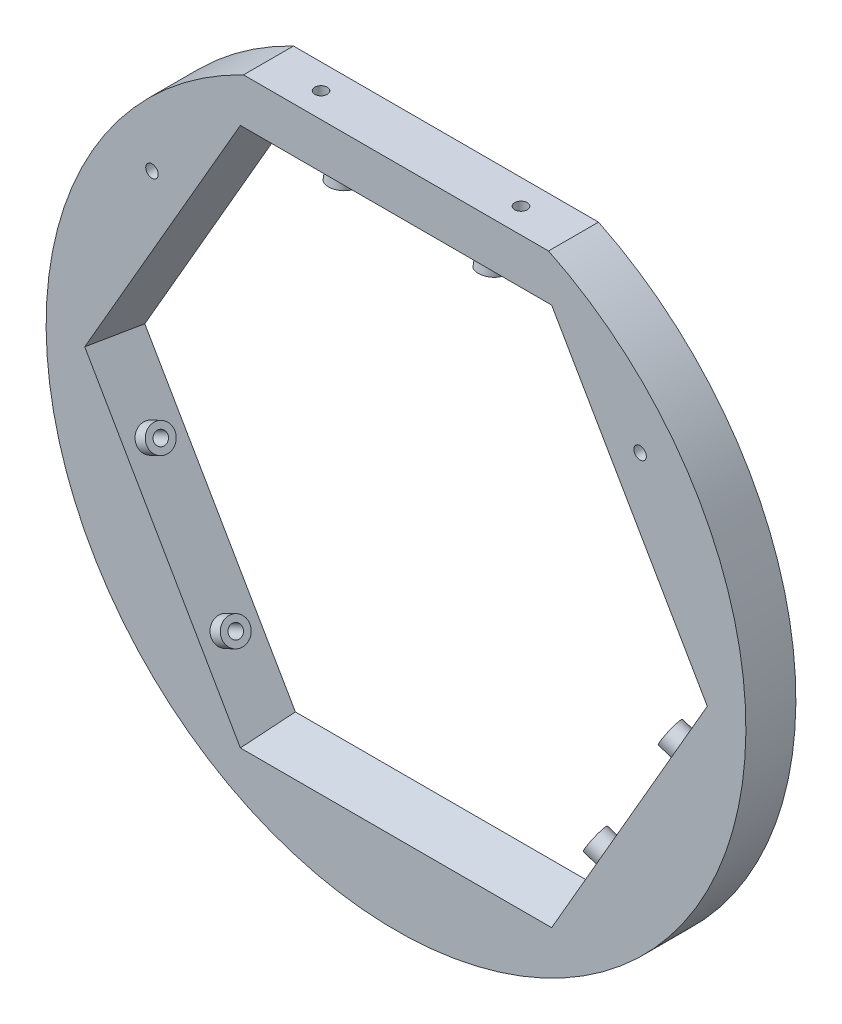
ISO-10303-21;
HEADER;
FILE_DESCRIPTION(('STEP AP214'),'2;1');
FILE_NAME('part.step','',(''),(''),'','','');
FILE_SCHEMA(('AUTOMOTIVE_DESIGN { 1 0 10303 214 1 1 1 1 }'));
ENDSEC;
DATA;
#1=APPLICATION_CONTEXT('core data for automotive mechanical design processes');
#2=APPLICATION_PROTOCOL_DEFINITION('international standard','automotive_design',2000,#1);
#3=PRODUCT_CONTEXT('',#1,'mechanical');
#4=PRODUCT('Part','Part','',(#3));
#5=PRODUCT_RELATED_PRODUCT_CATEGORY('part','',(#4));
#6=PRODUCT_DEFINITION_FORMATION('','',#4);
#7=PRODUCT_DEFINITION_CONTEXT('part definition',#1,'design');
#8=PRODUCT_DEFINITION('design','',#6,#7);
#9=PRODUCT_DEFINITION_SHAPE('','',#8);
#10=(LENGTH_UNIT() NAMED_UNIT(*) SI_UNIT(.MILLI.,.METRE.));
#11=(NAMED_UNIT(*) PLANE_ANGLE_UNIT() SI_UNIT($,.RADIAN.));
#12=(NAMED_UNIT(*) SI_UNIT($,.STERADIAN.) SOLID_ANGLE_UNIT());
#13=UNCERTAINTY_MEASURE_WITH_UNIT(LENGTH_MEASURE(1.E-05),#10,'distance_accuracy_value','');
#14=(GEOMETRIC_REPRESENTATION_CONTEXT(3) GLOBAL_UNCERTAINTY_ASSIGNED_CONTEXT((#13)) GLOBAL_UNIT_ASSIGNED_CONTEXT((#10,
#11,#12)) REPRESENTATION_CONTEXT('',''));
#15=CARTESIAN_POINT('',(0.,0.,0.));
#16=DIRECTION('',(0.,0.,1.));
#17=DIRECTION('',(1.,0.,0.));
#18=AXIS2_PLACEMENT_3D('',#15,#16,#17);
#19=CARTESIAN_POINT('',(30.1290237976606,52.185,-2.44364337792513E-08));
#20=DIRECTION('',(0.,0.985079303862054,-0.172101031672242));
#21=DIRECTION('',(-1.,0.,0.));
#22=AXIS2_PLACEMENT_3D('',#19,#20,#21);
#23=PLANE('',#22);
#24=CARTESIAN_POINT('',(-15.0000000000005,53.1583575704412,5.5713459958781));
#25=DIRECTION('',(0.,-0.985079303862054,0.172101031672243));
#26=DIRECTION('',(1.,0.,0.));
#27=AXIS2_PLACEMENT_3D('',#24,#25,#26);
#28=CIRCLE('',#27,2.5);
#29=CARTESIAN_POINT('',(-12.5000000000005,53.1583575704412,5.5713459958781));
#30=VERTEX_POINT('',#29);
#31=EDGE_CURVE('E207',#30,#30,#28,.T.);
#32=ORIENTED_EDGE('',*,*,#31,.F.);
#33=EDGE_LOOP('',(#32));
#34=FACE_BOUND('',#33,.T.);
#35=DIRECTION('',(0.0988756798636081,0.171257701156684,0.980252212303567));
#36=VECTOR('',#35,1.);
#37=CARTESIAN_POINT('',(29.5399170170226,51.1646371248516,-5.84039703409569));
#38=LINE('',#37,#36);
#39=CARTESIAN_POINT('',(30.1290237976606,52.185,0.));
#40=VERTEX_POINT('',#39);
#41=CARTESIAN_POINT('',(31.1376997166149,53.93207794,10.));
#42=VERTEX_POINT('',#41);
#43=EDGE_CURVE('E143',#40,#42,#38,.T.);
#44=ORIENTED_EDGE('',*,*,#43,.T.);
#45=DIRECTION('',(1.,0.,0.));
#46=VECTOR('',#45,1.);
#47=CARTESIAN_POINT('',(0.,53.93207794,10.));
#48=LINE('',#47,#46);
#49=CARTESIAN_POINT('',(-31.1376997166149,53.93207794,10.));
#50=VERTEX_POINT('',#49);
#51=EDGE_CURVE('E122',#50,#42,#48,.T.);
#52=ORIENTED_EDGE('',*,*,#51,.F.);
#53=DIRECTION('',(0.0988756798636086,-0.171257701156684,-0.980252212303567));
#54=VECTOR('',#53,1.);
#55=CARTESIAN_POINT('',(-30.1290237976606,52.185,-2.44364337792513E-08));
#56=LINE('',#55,#54);
#57=CARTESIAN_POINT('',(-30.1290237976606,52.185,0.));
#58=VERTEX_POINT('',#57);
#59=EDGE_CURVE('E137',#58,#50,#56,.F.);
#60=ORIENTED_EDGE('',*,*,#59,.F.);
#61=DIRECTION('',(-1.,0.,0.));
#62=VECTOR('',#61,1.);
#63=CARTESIAN_POINT('',(30.1290237976606,52.185,0.));
#64=LINE('',#63,#62);
#65=EDGE_CURVE('E160',#40,#58,#64,.T.);
#66=ORIENTED_EDGE('',*,*,#65,.F.);
#67=EDGE_LOOP('',(#44,#52,#60,#66));
#68=FACE_BOUND('',#67,.T.);
#69=CARTESIAN_POINT('',(14.9999999999995,53.1583575704414,5.57134599587811));
#70=DIRECTION('',(0.,-0.985079303862054,0.172101031672243));
#71=DIRECTION('',(1.,0.,0.));
#72=AXIS2_PLACEMENT_3D('',#69,#70,#71);
#73=CIRCLE('',#72,2.5);
#74=CARTESIAN_POINT('',(17.4999999999995,53.1583575704415,5.57134599587811));
#75=VERTEX_POINT('',#74);
#76=EDGE_CURVE('E194',#75,#75,#73,.T.);
#77=ORIENTED_EDGE('',*,*,#76,.F.);
#78=EDGE_LOOP('',(#77));
#79=FACE_BOUND('',#78,.T.);
#80=ADVANCED_FACE('F36',(#34,#68,#79),#23,.F.);
#81=CARTESIAN_POINT('',(30.1290237976606,-52.185,-2.44364337792513E-08));
#82=DIRECTION('',(0.85310370188683,-0.492539651931027,-0.172101031672243));
#83=DIRECTION('',(0.499999999999999,0.866025403784439,0.));
#84=AXIS2_PLACEMENT_3D('',#81,#82,#83);
#85=PLANE('',#84);
#86=CARTESIAN_POINT('',(53.5364880794591,-13.5887977284538,5.5713459958781));
#87=DIRECTION('',(-0.853103701886832,0.492539651931023,0.172101031672243));
#88=DIRECTION('',(-0.499999999999996,-0.866025403784441,0.));
#89=AXIS2_PLACEMENT_3D('',#86,#87,#88);
#90=CIRCLE('',#89,2.5);
#91=CARTESIAN_POINT('',(52.2864880794591,-15.7538612379149,5.5713459958781));
#92=VERTEX_POINT('',#91);
#93=EDGE_CURVE('E225',#92,#92,#90,.T.);
#94=ORIENTED_EDGE('',*,*,#93,.F.);
#95=EDGE_LOOP('',(#94));
#96=FACE_BOUND('',#95,.T.);
#97=DIRECTION('',(0.0988756798636078,-0.171257701156685,0.980252212303567));
#98=VECTOR('',#97,1.);
#99=CARTESIAN_POINT('',(29.5399170170226,-51.1646371248517,-5.84039703409571));
#100=LINE('',#99,#98);
#101=CARTESIAN_POINT('',(31.1376997166149,-53.93207794,10.));
#102=VERTEX_POINT('',#101);
#103=CARTESIAN_POINT('',(30.1290237976606,-52.185,0.));
#104=VERTEX_POINT('',#103);
#105=EDGE_CURVE('E145',#102,#104,#100,.F.);
#106=ORIENTED_EDGE('',*,*,#105,.F.);
#107=DIRECTION('',(-0.499999999999999,-0.866025403784439,0.));
#108=VECTOR('',#107,1.);
#109=CARTESIAN_POINT('',(46.7065495749224,-26.96603897,10.));
#110=LINE('',#109,#108);
#111=CARTESIAN_POINT('',(62.2753994332298,0.,10.));
#112=VERTEX_POINT('',#111);
#113=EDGE_CURVE('E130',#112,#102,#110,.T.);
#114=ORIENTED_EDGE('',*,*,#113,.F.);
#115=DIRECTION('',(0.197751359727216,0.,0.980252212303567));
#116=VECTOR('',#115,1.);
#117=CARTESIAN_POINT('',(59.0798340340452,0.,-5.84039703409571));
#118=LINE('',#117,#116);
#119=CARTESIAN_POINT('',(60.2580475953212,0.,0.));
#120=VERTEX_POINT('',#119);
#121=EDGE_CURVE('E41',#120,#112,#118,.T.);
#122=ORIENTED_EDGE('',*,*,#121,.F.);
#123=DIRECTION('',(0.499999999999999,0.866025403784439,0.));
#124=VECTOR('',#123,1.);
#125=CARTESIAN_POINT('',(30.1290237976606,-52.185,0.));
#126=LINE('',#125,#124);
#127=EDGE_CURVE('E152',#104,#120,#126,.T.);
#128=ORIENTED_EDGE('',*,*,#127,.F.);
#129=EDGE_LOOP('',(#106,#114,#122,#128));
#130=FACE_BOUND('',#129,.T.);
#131=CARTESIAN_POINT('',(38.5364880794592,-39.5695598419871,5.57134599587811));
#132=DIRECTION('',(-0.853103701886832,0.492539651931023,0.172101031672243));
#133=DIRECTION('',(-0.499999999999996,-0.866025403784441,0.));
#134=AXIS2_PLACEMENT_3D('',#131,#132,#133);
#135=CIRCLE('',#134,2.5);
#136=CARTESIAN_POINT('',(37.2864880794592,-41.7346233514482,5.57134599587811));
#137=VERTEX_POINT('',#136);
#138=EDGE_CURVE('E216',#137,#137,#135,.T.);
#139=ORIENTED_EDGE('',*,*,#138,.F.);
#140=EDGE_LOOP('',(#139));
#141=FACE_BOUND('',#140,.T.);
#142=ADVANCED_FACE('F39',(#96,#130,#141),#85,.F.);
#143=CARTESIAN_POINT('',(-60.2580475953212,0.,-2.44364337792513E-08));
#144=DIRECTION('',(-0.853103701886829,-0.492539651931027,-0.172101031672243));
#145=DIRECTION('',(0.5,-0.866025403784439,0.));
#146=AXIS2_PLACEMENT_3D('',#143,#144,#145);
#147=PLANE('',#146);
#148=CARTESIAN_POINT('',(-38.536488079459,-39.5695598419872,5.5713459958781));
#149=DIRECTION('',(0.853103701886829,0.492539651931027,0.172101031672243));
#150=DIRECTION('',(-0.5,0.866025403784439,0.));
#151=AXIS2_PLACEMENT_3D('',#148,#149,#150);
#152=CIRCLE('',#151,2.5);
#153=CARTESIAN_POINT('',(-39.786488079459,-37.4044963325261,5.5713459958781));
#154=VERTEX_POINT('',#153);
#155=EDGE_CURVE('E255',#154,#154,#152,.T.);
#156=ORIENTED_EDGE('',*,*,#155,.F.);
#157=EDGE_LOOP('',(#156));
#158=FACE_BOUND('',#157,.T.);
#159=DIRECTION('',(-0.0988756798636083,-0.171257701156685,0.980252212303567));
#160=VECTOR('',#159,1.);
#161=CARTESIAN_POINT('',(-29.5399170170226,-51.1646371248516,-5.84039703409576));
#162=LINE('',#161,#160);
#163=CARTESIAN_POINT('',(-31.1376997166148,-53.93207794,10.));
#164=VERTEX_POINT('',#163);
#165=CARTESIAN_POINT('',(-30.1290237976606,-52.185,0.));
#166=VERTEX_POINT('',#165);
#167=EDGE_CURVE('E140',#164,#166,#162,.F.);
#168=ORIENTED_EDGE('',*,*,#167,.T.);
#169=DIRECTION('',(0.5,-0.866025403784438,0.));
#170=VECTOR('',#169,1.);
#171=CARTESIAN_POINT('',(-60.2580475953212,0.,0.));
#172=LINE('',#171,#170);
#173=CARTESIAN_POINT('',(-60.2580475953212,0.,0.));
#174=VERTEX_POINT('',#173);
#175=EDGE_CURVE('E124',#174,#166,#172,.T.);
#176=ORIENTED_EDGE('',*,*,#175,.F.);
#177=DIRECTION('',(-0.197751359727216,0.,0.980252212303567));
#178=VECTOR('',#177,1.);
#179=CARTESIAN_POINT('',(-59.0798340340452,0.,-5.84039703409576));
#180=LINE('',#179,#178);
#181=CARTESIAN_POINT('',(-62.2753994332297,0.,10.));
#182=VERTEX_POINT('',#181);
#183=EDGE_CURVE('E135',#182,#174,#180,.F.);
#184=ORIENTED_EDGE('',*,*,#183,.F.);
#185=DIRECTION('',(-0.5,0.866025403784439,0.));
#186=VECTOR('',#185,1.);
#187=CARTESIAN_POINT('',(-46.7065495749223,-26.96603897,10.));
#188=LINE('',#187,#186);
#189=EDGE_CURVE('E46',#164,#182,#188,.T.);
#190=ORIENTED_EDGE('',*,*,#189,.F.);
#191=EDGE_LOOP('',(#168,#176,#184,#190));
#192=FACE_BOUND('',#191,.T.);
#193=CARTESIAN_POINT('',(-53.536488079459,-13.5887977284541,5.57134599587811));
#194=DIRECTION('',(0.853103701886829,0.492539651931027,0.172101031672243));
#195=DIRECTION('',(-0.5,0.866025403784439,0.));
#196=AXIS2_PLACEMENT_3D('',#193,#194,#195);
#197=CIRCLE('',#196,2.5);
#198=CARTESIAN_POINT('',(-54.786488079459,-11.423734218993,5.57134599587811));
#199=VERTEX_POINT('',#198);
#200=EDGE_CURVE('E246',#199,#199,#197,.T.);
#201=ORIENTED_EDGE('',*,*,#200,.F.);
#202=EDGE_LOOP('',(#201));
#203=FACE_BOUND('',#202,.T.);
#204=ADVANCED_FACE('F176',(#158,#192,#203),#147,.F.);
#205=CARTESIAN_POINT('',(0.,0.,10.));
#206=DIRECTION('',(0.,0.,1.));
#207=DIRECTION('',(1.,0.,0.));
#208=AXIS2_PLACEMENT_3D('',#205,#206,#207);
#209=PLANE('',#208);
#210=CARTESIAN_POINT('',(-48.8236502436069,37.185,10.));
#211=DIRECTION('',(0.,0.,1.));
#212=DIRECTION('',(1.,0.,0.));
#213=AXIS2_PLACEMENT_3D('',#210,#211,#212);
#214=CIRCLE('',#213,1.25);
#215=CARTESIAN_POINT('',(-47.5736502436069,37.185,10.));
#216=VERTEX_POINT('',#215);
#217=EDGE_CURVE('E668',#216,#216,#214,.F.);
#218=ORIENTED_EDGE('',*,*,#217,.T.);
#219=EDGE_LOOP('',(#218));
#220=FACE_BOUND('',#219,.T.);
#221=CARTESIAN_POINT('',(48.8236502436069,37.185,10.));
#222=DIRECTION('',(0.,0.,1.));
#223=DIRECTION('',(1.,0.,0.));
#224=AXIS2_PLACEMENT_3D('',#221,#222,#223);
#225=CIRCLE('',#224,1.25);
#226=CARTESIAN_POINT('',(50.0736502436069,37.185,10.));
#227=VERTEX_POINT('',#226);
#228=EDGE_CURVE('E682',#227,#227,#225,.F.);
#229=ORIENTED_EDGE('',*,*,#228,.T.);
#230=EDGE_LOOP('',(#229));
#231=FACE_BOUND('',#230,.T.);
#232=DIRECTION('',(-1.,0.,0.));
#233=VECTOR('',#232,1.);
#234=CARTESIAN_POINT('',(-30.512292605,62.9999999998957,10.));
#235=LINE('',#234,#233);
#236=CARTESIAN_POINT('',(30.512292605,62.9999999998957,10.));
#237=VERTEX_POINT('',#236);
#238=CARTESIAN_POINT('',(-30.512292605,62.9999999998957,10.));
#239=VERTEX_POINT('',#238);
#240=EDGE_CURVE('E54',#237,#239,#235,.T.);
#241=ORIENTED_EDGE('',*,*,#240,.T.);
#242=CARTESIAN_POINT('',(0.,0.,10.));
#243=DIRECTION('',(0.,0.,1.));
#244=DIRECTION('',(1.,0.,0.));
#245=AXIS2_PLACEMENT_3D('',#242,#243,#244);
#246=CIRCLE('',#245,70.);
#247=EDGE_CURVE('E119',#239,#237,#246,.T.);
#248=ORIENTED_EDGE('',*,*,#247,.T.);
#249=EDGE_LOOP('',(#241,#248));
#250=FACE_BOUND('',#249,.T.);
#251=ORIENTED_EDGE('',*,*,#189,.T.);
#252=DIRECTION('',(0.499999999999999,0.866025403784439,0.));
#253=VECTOR('',#252,1.);
#254=CARTESIAN_POINT('',(-46.7065495749223,26.96603897,10.));
#255=LINE('',#254,#253);
#256=EDGE_CURVE('E11',#182,#50,#255,.T.);
#257=ORIENTED_EDGE('',*,*,#256,.T.);
#258=ORIENTED_EDGE('',*,*,#51,.T.);
#259=DIRECTION('',(0.5,-0.866025403784439,0.));
#260=VECTOR('',#259,1.);
#261=CARTESIAN_POINT('',(46.7065495749223,26.96603897,10.));
#262=LINE('',#261,#260);
#263=EDGE_CURVE('E128',#42,#112,#262,.T.);
#264=ORIENTED_EDGE('',*,*,#263,.T.);
#265=ORIENTED_EDGE('',*,*,#113,.T.);
#266=DIRECTION('',(-1.,0.,0.));
#267=VECTOR('',#266,1.);
#268=CARTESIAN_POINT('',(0.,-53.93207794,10.));
#269=LINE('',#268,#267);
#270=EDGE_CURVE('E132',#102,#164,#269,.T.);
#271=ORIENTED_EDGE('',*,*,#270,.T.);
#272=EDGE_LOOP('',(#251,#257,#258,#264,#265,#271));
#273=FACE_BOUND('',#272,.T.);
#274=ADVANCED_FACE('F182',(#220,#231,#250,#273),#209,.T.);
#275=CARTESIAN_POINT('',(0.,0.,0.));
#276=DIRECTION('',(0.,0.,1.));
#277=DIRECTION('',(1.,0.,0.));
#278=AXIS2_PLACEMENT_3D('',#275,#276,#277);
#279=PLANE('',#278);
#280=CARTESIAN_POINT('',(-48.8236502436069,37.185,0.));
#281=DIRECTION('',(0.,0.,-1.));
#282=DIRECTION('',(-1.,0.,0.));
#283=AXIS2_PLACEMENT_3D('',#280,#281,#282);
#284=CIRCLE('',#283,1.25);
#285=CARTESIAN_POINT('',(-50.0736502436069,37.185,0.));
#286=VERTEX_POINT('',#285);
#287=EDGE_CURVE('E671',#286,#286,#284,.T.);
#288=ORIENTED_EDGE('',*,*,#287,.F.);
#289=EDGE_LOOP('',(#288));
#290=FACE_BOUND('',#289,.T.);
#291=CARTESIAN_POINT('',(48.8236502436069,37.185,0.));
#292=DIRECTION('',(0.,0.,-1.));
#293=DIRECTION('',(-1.,0.,0.));
#294=AXIS2_PLACEMENT_3D('',#291,#292,#293);
#295=CIRCLE('',#294,1.25);
#296=CARTESIAN_POINT('',(47.5736502436069,37.185,0.));
#297=VERTEX_POINT('',#296);
#298=EDGE_CURVE('E677',#297,#297,#295,.T.);
#299=ORIENTED_EDGE('',*,*,#298,.F.);
#300=EDGE_LOOP('',(#299));
#301=FACE_BOUND('',#300,.T.);
#302=CARTESIAN_POINT('',(0.,0.,0.));
#303=DIRECTION('',(0.,0.,1.));
#304=DIRECTION('',(1.,0.,0.));
#305=AXIS2_PLACEMENT_3D('',#302,#303,#304);
#306=CIRCLE('',#305,70.);
#307=CARTESIAN_POINT('',(-30.512292605,62.9999999998957,0.));
#308=VERTEX_POINT('',#307);
#309=CARTESIAN_POINT('',(30.512292605,62.9999999998957,0.));
#310=VERTEX_POINT('',#309);
#311=EDGE_CURVE('E115',#308,#310,#306,.T.);
#312=ORIENTED_EDGE('',*,*,#311,.F.);
#313=DIRECTION('',(-1.,0.,0.));
#314=VECTOR('',#313,1.);
#315=CARTESIAN_POINT('',(-30.512292605,62.9999999998957,0.));
#316=LINE('',#315,#314);
#317=EDGE_CURVE('E103',#310,#308,#316,.T.);
#318=ORIENTED_EDGE('',*,*,#317,.F.);
#319=EDGE_LOOP('',(#312,#318));
#320=FACE_BOUND('',#319,.T.);
#321=ORIENTED_EDGE('',*,*,#127,.T.);
#322=DIRECTION('',(-0.5,0.866025403784439,0.));
#323=VECTOR('',#322,1.);
#324=CARTESIAN_POINT('',(60.2580475953212,0.,0.));
#325=LINE('',#324,#323);
#326=EDGE_CURVE('E157',#120,#40,#325,.T.);
#327=ORIENTED_EDGE('',*,*,#326,.T.);
#328=ORIENTED_EDGE('',*,*,#65,.T.);
#329=DIRECTION('',(-0.499999999999999,-0.866025403784439,0.));
#330=VECTOR('',#329,1.);
#331=CARTESIAN_POINT('',(-30.1290237976606,52.185,0.));
#332=LINE('',#331,#330);
#333=EDGE_CURVE('E167',#58,#174,#332,.T.);
#334=ORIENTED_EDGE('',*,*,#333,.T.);
#335=ORIENTED_EDGE('',*,*,#175,.T.);
#336=DIRECTION('',(1.,0.,0.));
#337=VECTOR('',#336,1.);
#338=CARTESIAN_POINT('',(-30.1290237976606,-52.185,0.));
#339=LINE('',#338,#337);
#340=EDGE_CURVE('E120',#166,#104,#339,.T.);
#341=ORIENTED_EDGE('',*,*,#340,.T.);
#342=EDGE_LOOP('',(#321,#327,#328,#334,#335,#341));
#343=FACE_BOUND('',#342,.T.);
#344=ADVANCED_FACE('F113',(#290,#301,#320,#343),#279,.F.);
#345=CARTESIAN_POINT('',(0.,0.,10.));
#346=DIRECTION('',(0.,0.,-1.));
#347=DIRECTION('',(-1.,0.,0.));
#348=AXIS2_PLACEMENT_3D('',#345,#346,#347);
#349=CYLINDRICAL_SURFACE('',#348,70.);
#350=ORIENTED_EDGE('',*,*,#247,.F.);
#351=DIRECTION('',(0.,0.,-1.));
#352=VECTOR('',#351,1.);
#353=CARTESIAN_POINT('',(-30.512292605,62.9999999998957,10.001));
#354=LINE('',#353,#352);
#355=EDGE_CURVE('E109',#239,#308,#354,.T.);
#356=ORIENTED_EDGE('',*,*,#355,.T.);
#357=ORIENTED_EDGE('',*,*,#311,.T.);
#358=DIRECTION('',(0.,0.,-1.));
#359=VECTOR('',#358,1.);
#360=CARTESIAN_POINT('',(30.512292605,62.9999999998957,10.001));
#361=LINE('',#360,#359);
#362=EDGE_CURVE('E100',#237,#310,#361,.T.);
#363=ORIENTED_EDGE('',*,*,#362,.F.);
#364=EDGE_LOOP('',(#350,#356,#357,#363));
#365=FACE_BOUND('',#364,.T.);
#366=ADVANCED_FACE('F118',(#365),#349,.T.);
#367=CARTESIAN_POINT('',(60.2580475953212,0.,-2.44364337792513E-08));
#368=DIRECTION('',(0.853103701886829,0.492539651931027,-0.172101031672242));
#369=DIRECTION('',(-0.5,0.866025403784439,0.));
#370=AXIS2_PLACEMENT_3D('',#367,#368,#369);
#371=PLANE('',#370);
#372=ORIENTED_EDGE('',*,*,#121,.T.);
#373=ORIENTED_EDGE('',*,*,#263,.F.);
#374=ORIENTED_EDGE('',*,*,#43,.F.);
#375=ORIENTED_EDGE('',*,*,#326,.F.);
#376=EDGE_LOOP('',(#372,#373,#374,#375));
#377=FACE_BOUND('',#376,.T.);
#378=ADVANCED_FACE('F186',(#377),#371,.F.);
#379=CARTESIAN_POINT('',(-30.1290237976606,-52.185,-2.44364337792513E-08));
#380=DIRECTION('',(0.,-0.985079303862054,-0.172101031672243));
#381=DIRECTION('',(1.,0.,0.));
#382=AXIS2_PLACEMENT_3D('',#379,#380,#381);
#383=PLANE('',#382);
#384=ORIENTED_EDGE('',*,*,#105,.T.);
#385=ORIENTED_EDGE('',*,*,#340,.F.);
#386=ORIENTED_EDGE('',*,*,#167,.F.);
#387=ORIENTED_EDGE('',*,*,#270,.F.);
#388=EDGE_LOOP('',(#384,#385,#386,#387));
#389=FACE_BOUND('',#388,.T.);
#390=ADVANCED_FACE('F175',(#389),#383,.F.);
#391=CARTESIAN_POINT('',(-30.1290237976606,52.185,-2.44364337792513E-08));
#392=DIRECTION('',(-0.85310370188683,0.492539651931027,-0.172101031672243));
#393=DIRECTION('',(-0.499999999999999,-0.866025403784439,0.));
#394=AXIS2_PLACEMENT_3D('',#391,#392,#393);
#395=PLANE('',#394);
#396=ORIENTED_EDGE('',*,*,#59,.T.);
#397=ORIENTED_EDGE('',*,*,#256,.F.);
#398=ORIENTED_EDGE('',*,*,#183,.T.);
#399=ORIENTED_EDGE('',*,*,#333,.F.);
#400=EDGE_LOOP('',(#396,#397,#398,#399));
#401=FACE_BOUND('',#400,.T.);
#402=ADVANCED_FACE('F179',(#401),#395,.F.);
#403=CARTESIAN_POINT('',(-35.9771769737985,-38.0919408861941,6.08764909089483));
#404=DIRECTION('',(0.853103701886829,0.492539651931027,0.172101031672243));
#405=DIRECTION('',(-0.5,0.866025403784439,0.));
#406=AXIS2_PLACEMENT_3D('',#403,#404,#405);
#407=PLANE('',#406);
#408=CARTESIAN_POINT('',(-35.9771769737985,-38.0919408861941,6.08764909089483));
#409=DIRECTION('',(0.853103701886829,0.492539651931027,0.172101031672243));
#410=DIRECTION('',(-0.5,0.866025403784439,0.));
#411=AXIS2_PLACEMENT_3D('',#408,#409,#410);
#412=CIRCLE('',#411,2.5);
#413=CARTESIAN_POINT('',(-37.2271769737985,-35.926877376733,6.08764909089483));
#414=VERTEX_POINT('',#413);
#415=EDGE_CURVE('E256',#414,#414,#412,.T.);
#416=ORIENTED_EDGE('',*,*,#415,.T.);
#417=EDGE_LOOP('',(#416));
#418=FACE_BOUND('',#417,.T.);
#419=CARTESIAN_POINT('',(-35.9771769737985,-38.0919408861942,6.08764909089483));
#420=DIRECTION('',(0.853103701886829,0.492539651931027,0.172101031672243));
#421=DIRECTION('',(-0.5,0.866025403784439,0.));
#422=AXIS2_PLACEMENT_3D('',#419,#420,#421);
#423=CIRCLE('',#422,1.25);
#424=CARTESIAN_POINT('',(-36.6021769737985,-37.0094091314636,6.08764909089483));
#425=VERTEX_POINT('',#424);
#426=EDGE_CURVE('E250',#425,#425,#423,.T.);
#427=ORIENTED_EDGE('',*,*,#426,.F.);
#428=EDGE_LOOP('',(#427));
#429=FACE_BOUND('',#428,.T.);
#430=ADVANCED_FACE('F275',(#418,#429),#407,.T.);
#431=CARTESIAN_POINT('',(-35.9771769737985,-38.0919408861941,6.08764909089483));
#432=DIRECTION('',(-0.853103701886829,-0.492539651931027,-0.172101031672243));
#433=DIRECTION('',(0.5,-0.866025403784438,0.));
#434=AXIS2_PLACEMENT_3D('',#431,#432,#433);
#435=CYLINDRICAL_SURFACE('',#434,2.5);
#436=ORIENTED_EDGE('',*,*,#415,.F.);
#437=EDGE_LOOP('',(#436));
#438=FACE_BOUND('',#437,.T.);
#439=ORIENTED_EDGE('',*,*,#155,.T.);
#440=EDGE_LOOP('',(#439));
#441=FACE_BOUND('',#440,.T.);
#442=ADVANCED_FACE('F277',(#438,#441),#435,.T.);
#443=CARTESIAN_POINT('',(-45.3613176945536,-43.5098770574355,4.19453774250016));
#444=DIRECTION('',(0.853103701886829,0.492539651931027,0.172101031672243));
#445=DIRECTION('',(-0.5,0.866025403784439,0.));
#446=AXIS2_PLACEMENT_3D('',#443,#444,#445);
#447=PLANE('',#446);
#448=CARTESIAN_POINT('',(-45.3613176945536,-43.5098770574355,4.19453774250016));
#449=DIRECTION('',(0.853103701886829,0.492539651931027,0.172101031672243));
#450=DIRECTION('',(-0.5,0.866025403784439,0.));
#451=AXIS2_PLACEMENT_3D('',#448,#449,#450);
#452=CIRCLE('',#451,1.25);
#453=CARTESIAN_POINT('',(-45.9863176945536,-42.4273453027049,4.19453774250016));
#454=VERTEX_POINT('',#453);
#455=EDGE_CURVE('E163',#454,#454,#452,.T.);
#456=ORIENTED_EDGE('',*,*,#455,.T.);
#457=EDGE_LOOP('',(#456));
#458=FACE_BOUND('',#457,.T.);
#459=ADVANCED_FACE('F266',(#458),#447,.T.);
#460=CARTESIAN_POINT('',(-45.3613176945536,-43.5098770574355,4.19453774250016));
#461=DIRECTION('',(0.853103701886829,0.492539651931027,0.172101031672243));
#462=DIRECTION('',(-0.5,0.866025403784438,0.));
#463=AXIS2_PLACEMENT_3D('',#460,#461,#462);
#464=CYLINDRICAL_SURFACE('',#463,1.25);
#465=ORIENTED_EDGE('',*,*,#455,.F.);
#466=EDGE_LOOP('',(#465));
#467=FACE_BOUND('',#466,.T.);
#468=ORIENTED_EDGE('',*,*,#426,.T.);
#469=EDGE_LOOP('',(#468));
#470=FACE_BOUND('',#469,.T.);
#471=ADVANCED_FACE('F268',(#467,#470),#464,.F.);
#472=CARTESIAN_POINT('',(-50.9771769737985,-12.111178772661,6.08764909089484));
#473=DIRECTION('',(0.853103701886829,0.492539651931027,0.172101031672243));
#474=DIRECTION('',(-0.5,0.866025403784439,0.));
#475=AXIS2_PLACEMENT_3D('',#472,#473,#474);
#476=PLANE('',#475);
#477=CARTESIAN_POINT('',(-50.9771769737985,-12.111178772661,6.08764909089484));
#478=DIRECTION('',(0.853103701886829,0.492539651931027,0.172101031672243));
#479=DIRECTION('',(-0.5,0.866025403784439,0.));
#480=AXIS2_PLACEMENT_3D('',#477,#478,#479);
#481=CIRCLE('',#480,2.5);
#482=CARTESIAN_POINT('',(-52.2271769737985,-9.9461152631999,6.08764909089484));
#483=VERTEX_POINT('',#482);
#484=EDGE_CURVE('E247',#483,#483,#481,.T.);
#485=ORIENTED_EDGE('',*,*,#484,.T.);
#486=EDGE_LOOP('',(#485));
#487=FACE_BOUND('',#486,.T.);
#488=CARTESIAN_POINT('',(-50.9771769737985,-12.111178772661,6.08764909089483));
#489=DIRECTION('',(0.853103701886829,0.492539651931027,0.172101031672243));
#490=DIRECTION('',(-0.5,0.866025403784439,0.));
#491=AXIS2_PLACEMENT_3D('',#488,#489,#490);
#492=CIRCLE('',#491,1.25);
#493=CARTESIAN_POINT('',(-51.6021769737985,-11.0286470179304,6.08764909089483));
#494=VERTEX_POINT('',#493);
#495=EDGE_CURVE('E235',#494,#494,#492,.T.);
#496=ORIENTED_EDGE('',*,*,#495,.F.);
#497=EDGE_LOOP('',(#496));
#498=FACE_BOUND('',#497,.T.);
#499=ADVANCED_FACE('F271',(#487,#498),#476,.T.);
#500=CARTESIAN_POINT('',(-50.9771769737985,-12.111178772661,6.08764909089484));
#501=DIRECTION('',(-0.853103701886829,-0.492539651931027,-0.172101031672243));
#502=DIRECTION('',(0.5,-0.866025403784438,0.));
#503=AXIS2_PLACEMENT_3D('',#500,#501,#502);
#504=CYLINDRICAL_SURFACE('',#503,2.5);
#505=ORIENTED_EDGE('',*,*,#484,.F.);
#506=EDGE_LOOP('',(#505));
#507=FACE_BOUND('',#506,.T.);
#508=ORIENTED_EDGE('',*,*,#200,.T.);
#509=EDGE_LOOP('',(#508));
#510=FACE_BOUND('',#509,.T.);
#511=ADVANCED_FACE('F288',(#507,#510),#504,.T.);
#512=CARTESIAN_POINT('',(-60.3613176945536,-17.5291149439023,4.19453774250016));
#513=DIRECTION('',(0.853103701886829,0.492539651931027,0.172101031672243));
#514=DIRECTION('',(-0.5,0.866025403784439,0.));
#515=AXIS2_PLACEMENT_3D('',#512,#513,#514);
#516=PLANE('',#515);
#517=CARTESIAN_POINT('',(-60.3613176945536,-17.5291149439023,4.19453774250016));
#518=DIRECTION('',(0.853103701886829,0.492539651931027,0.172101031672243));
#519=DIRECTION('',(-0.5,0.866025403784439,0.));
#520=AXIS2_PLACEMENT_3D('',#517,#518,#519);
#521=CIRCLE('',#520,1.25);
#522=CARTESIAN_POINT('',(-60.9863176945536,-16.4465831891717,4.19453774250016));
#523=VERTEX_POINT('',#522);
#524=EDGE_CURVE('E138',#523,#523,#521,.T.);
#525=ORIENTED_EDGE('',*,*,#524,.T.);
#526=EDGE_LOOP('',(#525));
#527=FACE_BOUND('',#526,.T.);
#528=ADVANCED_FACE('F291',(#527),#516,.T.);
#529=CARTESIAN_POINT('',(-60.3613176945536,-17.5291149439023,4.19453774250016));
#530=DIRECTION('',(0.853103701886829,0.492539651931027,0.172101031672243));
#531=DIRECTION('',(-0.5,0.866025403784438,0.));
#532=AXIS2_PLACEMENT_3D('',#529,#530,#531);
#533=CYLINDRICAL_SURFACE('',#532,1.25);
#534=ORIENTED_EDGE('',*,*,#524,.F.);
#535=EDGE_LOOP('',(#534));
#536=FACE_BOUND('',#535,.T.);
#537=ORIENTED_EDGE('',*,*,#495,.T.);
#538=EDGE_LOOP('',(#537));
#539=FACE_BOUND('',#538,.T.);
#540=ADVANCED_FACE('F294',(#536,#539),#533,.F.);
#541=CARTESIAN_POINT('',(50.9771769737986,-12.1111787726607,6.08764909089483));
#542=DIRECTION('',(-0.853103701886832,0.492539651931023,0.172101031672243));
#543=DIRECTION('',(-0.499999999999996,-0.866025403784441,0.));
#544=AXIS2_PLACEMENT_3D('',#541,#542,#543);
#545=PLANE('',#544);
#546=CARTESIAN_POINT('',(50.9771769737986,-12.1111787726607,6.08764909089483));
#547=DIRECTION('',(-0.853103701886832,0.492539651931023,0.172101031672243));
#548=DIRECTION('',(-0.499999999999996,-0.866025403784441,0.));
#549=AXIS2_PLACEMENT_3D('',#546,#547,#548);
#550=CIRCLE('',#549,2.5);
#551=CARTESIAN_POINT('',(49.7271769737986,-14.2762422821219,6.08764909089483));
#552=VERTEX_POINT('',#551);
#553=EDGE_CURVE('E226',#552,#552,#550,.T.);
#554=ORIENTED_EDGE('',*,*,#553,.T.);
#555=EDGE_LOOP('',(#554));
#556=FACE_BOUND('',#555,.T.);
#557=CARTESIAN_POINT('',(50.9771769737986,-12.1111787726607,6.08764909089483));
#558=DIRECTION('',(-0.853103701886832,0.492539651931023,0.172101031672243));
#559=DIRECTION('',(-0.499999999999996,-0.866025403784441,0.));
#560=AXIS2_PLACEMENT_3D('',#557,#558,#559);
#561=CIRCLE('',#560,1.25);
#562=CARTESIAN_POINT('',(50.3521769737986,-13.1937105273913,6.08764909089483));
#563=VERTEX_POINT('',#562);
#564=EDGE_CURVE('E220',#563,#563,#561,.T.);
#565=ORIENTED_EDGE('',*,*,#564,.F.);
#566=EDGE_LOOP('',(#565));
#567=FACE_BOUND('',#566,.T.);
#568=ADVANCED_FACE('F297',(#556,#567),#545,.T.);
#569=CARTESIAN_POINT('',(50.9771769737986,-12.1111787726607,6.08764909089483));
#570=DIRECTION('',(0.853103701886832,-0.492539651931023,-0.172101031672243));
#571=DIRECTION('',(0.499999999999996,0.866025403784441,0.));
#572=AXIS2_PLACEMENT_3D('',#569,#570,#571);
#573=CYLINDRICAL_SURFACE('',#572,2.5);
#574=ORIENTED_EDGE('',*,*,#553,.F.);
#575=EDGE_LOOP('',(#574));
#576=FACE_BOUND('',#575,.T.);
#577=ORIENTED_EDGE('',*,*,#93,.T.);
#578=EDGE_LOOP('',(#577));
#579=FACE_BOUND('',#578,.T.);
#580=ADVANCED_FACE('F424',(#576,#579),#573,.T.);
#581=CARTESIAN_POINT('',(60.3613176945537,-17.529114943902,4.19453774250016));
#582=DIRECTION('',(-0.853103701886832,0.492539651931023,0.172101031672243));
#583=DIRECTION('',(-0.499999999999996,-0.866025403784441,0.));
#584=AXIS2_PLACEMENT_3D('',#581,#582,#583);
#585=PLANE('',#584);
#586=CARTESIAN_POINT('',(60.3613176945537,-17.529114943902,4.19453774250016));
#587=DIRECTION('',(-0.853103701886832,0.492539651931023,0.172101031672243));
#588=DIRECTION('',(-0.499999999999996,-0.866025403784441,0.));
#589=AXIS2_PLACEMENT_3D('',#586,#587,#588);
#590=CIRCLE('',#589,1.25);
#591=CARTESIAN_POINT('',(59.7363176945537,-18.6116466986326,4.19453774250016));
#592=VERTEX_POINT('',#591);
#593=EDGE_CURVE('E236',#592,#592,#590,.T.);
#594=ORIENTED_EDGE('',*,*,#593,.T.);
#595=EDGE_LOOP('',(#594));
#596=FACE_BOUND('',#595,.T.);
#597=ADVANCED_FACE('F434',(#596),#585,.T.);
#598=CARTESIAN_POINT('',(60.3613176945537,-17.529114943902,4.19453774250016));
#599=DIRECTION('',(-0.853103701886832,0.492539651931023,0.172101031672243));
#600=DIRECTION('',(-0.499999999999996,-0.866025403784441,0.));
#601=AXIS2_PLACEMENT_3D('',#598,#599,#600);
#602=CYLINDRICAL_SURFACE('',#601,1.25);
#603=ORIENTED_EDGE('',*,*,#593,.F.);
#604=EDGE_LOOP('',(#603));
#605=FACE_BOUND('',#604,.T.);
#606=ORIENTED_EDGE('',*,*,#564,.T.);
#607=EDGE_LOOP('',(#606));
#608=FACE_BOUND('',#607,.T.);
#609=ADVANCED_FACE('F445',(#605,#608),#602,.F.);
#610=CARTESIAN_POINT('',(35.9771769737987,-38.091940886194,6.08764909089484));
#611=DIRECTION('',(-0.853103701886832,0.492539651931023,0.172101031672243));
#612=DIRECTION('',(-0.499999999999996,-0.866025403784441,0.));
#613=AXIS2_PLACEMENT_3D('',#610,#611,#612);
#614=PLANE('',#613);
#615=CARTESIAN_POINT('',(35.9771769737987,-38.091940886194,6.08764909089484));
#616=DIRECTION('',(-0.853103701886832,0.492539651931023,0.172101031672243));
#617=DIRECTION('',(-0.499999999999996,-0.866025403784441,0.));
#618=AXIS2_PLACEMENT_3D('',#615,#616,#617);
#619=CIRCLE('',#618,2.5);
#620=CARTESIAN_POINT('',(34.7271769737987,-40.2570043956551,6.08764909089484));
#621=VERTEX_POINT('',#620);
#622=EDGE_CURVE('E217',#621,#621,#619,.T.);
#623=ORIENTED_EDGE('',*,*,#622,.T.);
#624=EDGE_LOOP('',(#623));
#625=FACE_BOUND('',#624,.T.);
#626=CARTESIAN_POINT('',(35.9771769737987,-38.091940886194,6.08764909089483));
#627=DIRECTION('',(-0.853103701886832,0.492539651931023,0.172101031672243));
#628=DIRECTION('',(-0.499999999999996,-0.866025403784441,0.));
#629=AXIS2_PLACEMENT_3D('',#626,#627,#628);
#630=CIRCLE('',#629,1.25);
#631=CARTESIAN_POINT('',(35.3521769737987,-39.1744726409245,6.08764909089483));
#632=VERTEX_POINT('',#631);
#633=EDGE_CURVE('E211',#632,#632,#630,.T.);
#634=ORIENTED_EDGE('',*,*,#633,.F.);
#635=EDGE_LOOP('',(#634));
#636=FACE_BOUND('',#635,.T.);
#637=ADVANCED_FACE('F456',(#625,#636),#614,.T.);
#638=CARTESIAN_POINT('',(35.9771769737987,-38.091940886194,6.08764909089484));
#639=DIRECTION('',(0.853103701886832,-0.492539651931023,-0.172101031672243));
#640=DIRECTION('',(0.499999999999996,0.866025403784441,0.));
#641=AXIS2_PLACEMENT_3D('',#638,#639,#640);
#642=CYLINDRICAL_SURFACE('',#641,2.5);
#643=ORIENTED_EDGE('',*,*,#622,.F.);
#644=EDGE_LOOP('',(#643));
#645=FACE_BOUND('',#644,.T.);
#646=ORIENTED_EDGE('',*,*,#138,.T.);
#647=EDGE_LOOP('',(#646));
#648=FACE_BOUND('',#647,.T.);
#649=ADVANCED_FACE('F466',(#645,#648),#642,.T.);
#650=CARTESIAN_POINT('',(45.3613176945538,-43.5098770574352,4.19453774250016));
#651=DIRECTION('',(-0.853103701886832,0.492539651931023,0.172101031672243));
#652=DIRECTION('',(-0.499999999999996,-0.866025403784441,0.));
#653=AXIS2_PLACEMENT_3D('',#650,#651,#652);
#654=PLANE('',#653);
#655=CARTESIAN_POINT('',(45.3613176945538,-43.5098770574352,4.19453774250016));
#656=DIRECTION('',(-0.853103701886832,0.492539651931023,0.172101031672243));
#657=DIRECTION('',(-0.499999999999996,-0.866025403784441,0.));
#658=AXIS2_PLACEMENT_3D('',#655,#656,#657);
#659=CIRCLE('',#658,1.25);
#660=CARTESIAN_POINT('',(44.7363176945539,-44.5924088121658,4.19453774250016));
#661=VERTEX_POINT('',#660);
#662=EDGE_CURVE('E232',#661,#661,#659,.T.);
#663=ORIENTED_EDGE('',*,*,#662,.T.);
#664=EDGE_LOOP('',(#663));
#665=FACE_BOUND('',#664,.T.);
#666=ADVANCED_FACE('F476',(#665),#654,.T.);
#667=CARTESIAN_POINT('',(45.3613176945538,-43.5098770574352,4.19453774250016));
#668=DIRECTION('',(-0.853103701886832,0.492539651931023,0.172101031672243));
#669=DIRECTION('',(-0.499999999999996,-0.866025403784441,0.));
#670=AXIS2_PLACEMENT_3D('',#667,#668,#669);
#671=CYLINDRICAL_SURFACE('',#670,1.25);
#672=ORIENTED_EDGE('',*,*,#662,.F.);
#673=EDGE_LOOP('',(#672));
#674=FACE_BOUND('',#673,.T.);
#675=ORIENTED_EDGE('',*,*,#633,.T.);
#676=EDGE_LOOP('',(#675));
#677=FACE_BOUND('',#676,.T.);
#678=ADVANCED_FACE('F486',(#674,#677),#671,.F.);
#679=CARTESIAN_POINT('',(-15.0000000000005,50.203119658855,6.08764909089483));
#680=DIRECTION('',(0.,-0.985079303862054,0.172101031672243));
#681=DIRECTION('',(1.,0.,0.));
#682=AXIS2_PLACEMENT_3D('',#679,#680,#681);
#683=PLANE('',#682);
#684=CARTESIAN_POINT('',(-15.0000000000005,50.203119658855,6.08764909089483));
#685=DIRECTION('',(0.,-0.985079303862054,0.172101031672243));
#686=DIRECTION('',(1.,0.,0.));
#687=AXIS2_PLACEMENT_3D('',#684,#685,#686);
#688=CIRCLE('',#687,2.5);
#689=CARTESIAN_POINT('',(-12.5000000000005,50.203119658855,6.08764909089483));
#690=VERTEX_POINT('',#689);
#691=EDGE_CURVE('E208',#690,#690,#688,.T.);
#692=ORIENTED_EDGE('',*,*,#691,.T.);
#693=EDGE_LOOP('',(#692));
#694=FACE_BOUND('',#693,.T.);
#695=CARTESIAN_POINT('',(-15.0000000000005,50.203119658855,6.08764909089483));
#696=DIRECTION('',(0.,-0.985079303862054,0.172101031672243));
#697=DIRECTION('',(1.,0.,0.));
#698=AXIS2_PLACEMENT_3D('',#695,#696,#697);
#699=CIRCLE('',#698,1.25);
#700=CARTESIAN_POINT('',(-13.7500000000005,50.203119658855,6.08764909089483));
#701=VERTEX_POINT('',#700);
#702=EDGE_CURVE('E200',#701,#701,#699,.T.);
#703=ORIENTED_EDGE('',*,*,#702,.F.);
#704=EDGE_LOOP('',(#703));
#705=FACE_BOUND('',#704,.T.);
#706=ADVANCED_FACE('F495',(#694,#705),#683,.T.);
#707=CARTESIAN_POINT('',(-15.0000000000005,50.203119658855,6.08764909089483));
#708=DIRECTION('',(0.,0.985079303862054,-0.172101031672243));
#709=DIRECTION('',(0.,0.172101031672243,0.985079303862054));
#710=AXIS2_PLACEMENT_3D('',#707,#708,#709);
#711=CYLINDRICAL_SURFACE('',#710,2.5);
#712=ORIENTED_EDGE('',*,*,#691,.F.);
#713=EDGE_LOOP('',(#712));
#714=FACE_BOUND('',#713,.T.);
#715=ORIENTED_EDGE('',*,*,#31,.T.);
#716=EDGE_LOOP('',(#715));
#717=FACE_BOUND('',#716,.T.);
#718=ADVANCED_FACE('F505',(#714,#717),#711,.T.);
#719=CARTESIAN_POINT('',(-15.0000000000006,61.0389920013376,4.19453774250016));
#720=DIRECTION('',(0.,-0.985079303862054,0.172101031672243));
#721=DIRECTION('',(1.,0.,0.));
#722=AXIS2_PLACEMENT_3D('',#719,#720,#721);
#723=PLANE('',#722);
#724=CARTESIAN_POINT('',(-15.0000000000006,61.0389920013376,4.19453774250016));
#725=DIRECTION('',(0.,-0.985079303862054,0.172101031672243));
#726=DIRECTION('',(1.,0.,0.));
#727=AXIS2_PLACEMENT_3D('',#724,#725,#726);
#728=CIRCLE('',#727,1.25);
#729=CARTESIAN_POINT('',(-13.7500000000006,61.0389920013376,4.19453774250016));
#730=VERTEX_POINT('',#729);
#731=EDGE_CURVE('E229',#730,#730,#728,.T.);
#732=ORIENTED_EDGE('',*,*,#731,.T.);
#733=EDGE_LOOP('',(#732));
#734=FACE_BOUND('',#733,.T.);
#735=ADVANCED_FACE('F515',(#734),#723,.T.);
#736=CARTESIAN_POINT('',(-15.0000000000006,61.0389920013376,4.19453774250016));
#737=DIRECTION('',(0.,-0.985079303862054,0.172101031672243));
#738=DIRECTION('',(0.,-0.172101031672243,-0.985079303862054));
#739=AXIS2_PLACEMENT_3D('',#736,#737,#738);
#740=CYLINDRICAL_SURFACE('',#739,1.25);
#741=ORIENTED_EDGE('',*,*,#731,.F.);
#742=EDGE_LOOP('',(#741));
#743=FACE_BOUND('',#742,.T.);
#744=ORIENTED_EDGE('',*,*,#702,.T.);
#745=EDGE_LOOP('',(#744));
#746=FACE_BOUND('',#745,.T.);
#747=ADVANCED_FACE('F526',(#743,#746),#740,.F.);
#748=CARTESIAN_POINT('',(14.9999999999995,50.2031196588553,6.08764909089484));
#749=DIRECTION('',(0.,-0.985079303862054,0.172101031672243));
#750=DIRECTION('',(1.,0.,0.));
#751=AXIS2_PLACEMENT_3D('',#748,#749,#750);
#752=PLANE('',#751);
#753=CARTESIAN_POINT('',(14.9999999999995,50.2031196588553,6.08764909089484));
#754=DIRECTION('',(0.,-0.985079303862054,0.172101031672243));
#755=DIRECTION('',(1.,0.,0.));
#756=AXIS2_PLACEMENT_3D('',#753,#754,#755);
#757=CIRCLE('',#756,2.5);
#758=CARTESIAN_POINT('',(17.4999999999995,50.2031196588553,6.08764909089484));
#759=VERTEX_POINT('',#758);
#760=EDGE_CURVE('E196',#759,#759,#757,.T.);
#761=ORIENTED_EDGE('',*,*,#760,.T.);
#762=EDGE_LOOP('',(#761));
#763=FACE_BOUND('',#762,.T.);
#764=CARTESIAN_POINT('',(14.9999999999995,50.2031196588553,6.08764909089483));
#765=DIRECTION('',(0.,-0.985079303862054,0.172101031672243));
#766=DIRECTION('',(1.,0.,0.));
#767=AXIS2_PLACEMENT_3D('',#764,#765,#766);
#768=CIRCLE('',#767,1.25);
#769=CARTESIAN_POINT('',(16.2499999999995,50.2031196588553,6.08764909089483));
#770=VERTEX_POINT('',#769);
#771=EDGE_CURVE('E197',#770,#770,#768,.T.);
#772=ORIENTED_EDGE('',*,*,#771,.F.);
#773=EDGE_LOOP('',(#772));
#774=FACE_BOUND('',#773,.T.);
#775=ADVANCED_FACE('F536',(#763,#774),#752,.T.);
#776=CARTESIAN_POINT('',(14.9999999999995,50.2031196588553,6.08764909089484));
#777=DIRECTION('',(0.,0.985079303862054,-0.172101031672243));
#778=DIRECTION('',(0.,0.172101031672243,0.985079303862054));
#779=AXIS2_PLACEMENT_3D('',#776,#777,#778);
#780=CYLINDRICAL_SURFACE('',#779,2.5);
#781=ORIENTED_EDGE('',*,*,#760,.F.);
#782=EDGE_LOOP('',(#781));
#783=FACE_BOUND('',#782,.T.);
#784=ORIENTED_EDGE('',*,*,#76,.T.);
#785=EDGE_LOOP('',(#784));
#786=FACE_BOUND('',#785,.T.);
#787=ADVANCED_FACE('F546',(#783,#786),#780,.T.);
#788=CARTESIAN_POINT('',(14.9999999999994,61.0389920013379,4.19453774250016));
#789=DIRECTION('',(0.,-0.985079303862054,0.172101031672243));
#790=DIRECTION('',(1.,0.,0.));
#791=AXIS2_PLACEMENT_3D('',#788,#789,#790);
#792=PLANE('',#791);
#793=CARTESIAN_POINT('',(14.9999999999994,61.0389920013379,4.19453774250016));
#794=DIRECTION('',(0.,-0.985079303862054,0.172101031672243));
#795=DIRECTION('',(1.,0.,0.));
#796=AXIS2_PLACEMENT_3D('',#793,#794,#795);
#797=CIRCLE('',#796,1.25);
#798=CARTESIAN_POINT('',(16.2499999999994,61.0389920013379,4.19453774250016));
#799=VERTEX_POINT('',#798);
#800=EDGE_CURVE('E239',#799,#799,#797,.T.);
#801=ORIENTED_EDGE('',*,*,#800,.T.);
#802=EDGE_LOOP('',(#801));
#803=FACE_BOUND('',#802,.T.);
#804=ADVANCED_FACE('F556',(#803),#792,.T.);
#805=CARTESIAN_POINT('',(14.9999999999994,61.0389920013379,4.19453774250016));
#806=DIRECTION('',(0.,-0.985079303862054,0.172101031672243));
#807=DIRECTION('',(0.,-0.172101031672243,-0.985079303862054));
#808=AXIS2_PLACEMENT_3D('',#805,#806,#807);
#809=CYLINDRICAL_SURFACE('',#808,1.25);
#810=ORIENTED_EDGE('',*,*,#800,.F.);
#811=EDGE_LOOP('',(#810));
#812=FACE_BOUND('',#811,.T.);
#813=ORIENTED_EDGE('',*,*,#771,.T.);
#814=EDGE_LOOP('',(#813));
#815=FACE_BOUND('',#814,.T.);
#816=ADVANCED_FACE('F567',(#812,#815),#809,.F.);
#817=CARTESIAN_POINT('',(-30.512292605,62.9999999998957,10.001));
#818=DIRECTION('',(0.,-1.,0.));
#819=DIRECTION('',(0.,0.,-1.));
#820=AXIS2_PLACEMENT_3D('',#817,#818,#819);
#821=PLANE('',#820);
#822=CARTESIAN_POINT('',(-20.,62.9999999998957,5.));
#823=DIRECTION('',(0.,1.,0.));
#824=DIRECTION('',(0.,0.,1.));
#825=AXIS2_PLACEMENT_3D('',#822,#823,#824);
#826=CIRCLE('',#825,1.25);
#827=CARTESIAN_POINT('',(-20.,62.9999999998957,6.25));
#828=VERTEX_POINT('',#827);
#829=EDGE_CURVE('E687',#828,#828,#826,.T.);
#830=ORIENTED_EDGE('',*,*,#829,.F.);
#831=EDGE_LOOP('',(#830));
#832=FACE_BOUND('',#831,.T.);
#833=CARTESIAN_POINT('',(20.,62.9999999998957,5.));
#834=DIRECTION('',(0.,1.,0.));
#835=DIRECTION('',(0.,0.,1.));
#836=AXIS2_PLACEMENT_3D('',#833,#834,#835);
#837=CIRCLE('',#836,1.25);
#838=CARTESIAN_POINT('',(20.,62.9999999998957,6.25));
#839=VERTEX_POINT('',#838);
#840=EDGE_CURVE('E672',#839,#839,#837,.T.);
#841=ORIENTED_EDGE('',*,*,#840,.F.);
#842=EDGE_LOOP('',(#841));
#843=FACE_BOUND('',#842,.T.);
#844=ORIENTED_EDGE('',*,*,#362,.T.);
#845=ORIENTED_EDGE('',*,*,#317,.T.);
#846=ORIENTED_EDGE('',*,*,#355,.F.);
#847=ORIENTED_EDGE('',*,*,#240,.F.);
#848=EDGE_LOOP('',(#844,#845,#846,#847));
#849=FACE_BOUND('',#848,.T.);
#850=ADVANCED_FACE('F102',(#832,#843,#849),#821,.F.);
#851=CARTESIAN_POINT('',(20.,54.9999999998957,5.));
#852=DIRECTION('',(0.,1.,0.));
#853=DIRECTION('',(0.,0.,1.));
#854=AXIS2_PLACEMENT_3D('',#851,#852,#853);
#855=CYLINDRICAL_SURFACE('',#854,1.25);
#856=CARTESIAN_POINT('',(20.,54.9999999998957,5.));
#857=DIRECTION('',(0.,1.,0.));
#858=DIRECTION('',(0.,0.,1.));
#859=AXIS2_PLACEMENT_3D('',#856,#857,#858);
#860=CIRCLE('',#859,1.25);
#861=CARTESIAN_POINT('',(20.,54.9999999998957,6.25));
#862=VERTEX_POINT('',#861);
#863=EDGE_CURVE('E675',#862,#862,#860,.T.);
#864=ORIENTED_EDGE('',*,*,#863,.F.);
#865=EDGE_LOOP('',(#864));
#866=FACE_BOUND('',#865,.T.);
#867=ORIENTED_EDGE('',*,*,#840,.T.);
#868=EDGE_LOOP('',(#867));
#869=FACE_BOUND('',#868,.T.);
#870=ADVANCED_FACE('F590',(#866,#869),#855,.F.);
#871=CARTESIAN_POINT('',(20.,54.9999999998957,5.));
#872=DIRECTION('',(0.,1.,0.));
#873=DIRECTION('',(0.,0.,1.));
#874=AXIS2_PLACEMENT_3D('',#871,#872,#873);
#875=PLANE('',#874);
#876=ORIENTED_EDGE('',*,*,#863,.T.);
#877=EDGE_LOOP('',(#876));
#878=FACE_BOUND('',#877,.T.);
#879=ADVANCED_FACE('F600',(#878),#875,.T.);
#880=CARTESIAN_POINT('',(-20.,54.9999999998957,5.));
#881=DIRECTION('',(0.,1.,0.));
#882=DIRECTION('',(0.,0.,1.));
#883=AXIS2_PLACEMENT_3D('',#880,#881,#882);
#884=CYLINDRICAL_SURFACE('',#883,1.25);
#885=CARTESIAN_POINT('',(-20.,54.9999999998957,5.));
#886=DIRECTION('',(0.,1.,0.));
#887=DIRECTION('',(0.,0.,1.));
#888=AXIS2_PLACEMENT_3D('',#885,#886,#887);
#889=CIRCLE('',#888,1.25);
#890=CARTESIAN_POINT('',(-20.,54.9999999998957,6.25));
#891=VERTEX_POINT('',#890);
#892=EDGE_CURVE('E116',#891,#891,#889,.T.);
#893=ORIENTED_EDGE('',*,*,#892,.F.);
#894=EDGE_LOOP('',(#893));
#895=FACE_BOUND('',#894,.T.);
#896=ORIENTED_EDGE('',*,*,#829,.T.);
#897=EDGE_LOOP('',(#896));
#898=FACE_BOUND('',#897,.T.);
#899=ADVANCED_FACE('F610',(#895,#898),#884,.F.);
#900=CARTESIAN_POINT('',(-20.,54.9999999998957,5.));
#901=DIRECTION('',(0.,1.,0.));
#902=DIRECTION('',(0.,0.,1.));
#903=AXIS2_PLACEMENT_3D('',#900,#901,#902);
#904=PLANE('',#903);
#905=ORIENTED_EDGE('',*,*,#892,.T.);
#906=EDGE_LOOP('',(#905));
#907=FACE_BOUND('',#906,.T.);
#908=ADVANCED_FACE('F620',(#907),#904,.T.);
#909=CARTESIAN_POINT('',(48.8236502436069,37.185,10.001));
#910=DIRECTION('',(0.,0.,-1.));
#911=DIRECTION('',(-1.,0.,0.));
#912=AXIS2_PLACEMENT_3D('',#909,#910,#911);
#913=CYLINDRICAL_SURFACE('',#912,1.25);
#914=ORIENTED_EDGE('',*,*,#228,.F.);
#915=EDGE_LOOP('',(#914));
#916=FACE_BOUND('',#915,.T.);
#917=ORIENTED_EDGE('',*,*,#298,.T.);
#918=EDGE_LOOP('',(#917));
#919=FACE_BOUND('',#918,.T.);
#920=ADVANCED_FACE('F630',(#916,#919),#913,.F.);
#921=CARTESIAN_POINT('',(-48.8236502436069,37.185,10.001));
#922=DIRECTION('',(0.,0.,-1.));
#923=DIRECTION('',(-1.,0.,0.));
#924=AXIS2_PLACEMENT_3D('',#921,#922,#923);
#925=CYLINDRICAL_SURFACE('',#924,1.25);
#926=ORIENTED_EDGE('',*,*,#217,.F.);
#927=EDGE_LOOP('',(#926));
#928=FACE_BOUND('',#927,.T.);
#929=ORIENTED_EDGE('',*,*,#287,.T.);
#930=EDGE_LOOP('',(#929));
#931=FACE_BOUND('',#930,.T.);
#932=ADVANCED_FACE('F651',(#928,#931),#925,.F.);
#933=CLOSED_SHELL('',(#80,#142,#204,#274,#344,#366,#378,#390,#402,#430,#442,#459,#471,#499,#511,
#528,#540,#568,#580,#597,#609,#637,#649,#666,#678,#706,#718,#735,#747,#775,#787,#804,#816,#850,
#870,#879,#899,#908,#920,#932));
#934=MANIFOLD_SOLID_BREP('B2',#933);
#935=ADVANCED_BREP_SHAPE_REPRESENTATION('',(#18,#934),#14);
#936=SHAPE_DEFINITION_REPRESENTATION(#9,#935);
ENDSEC;
END-ISO-10303-21;
